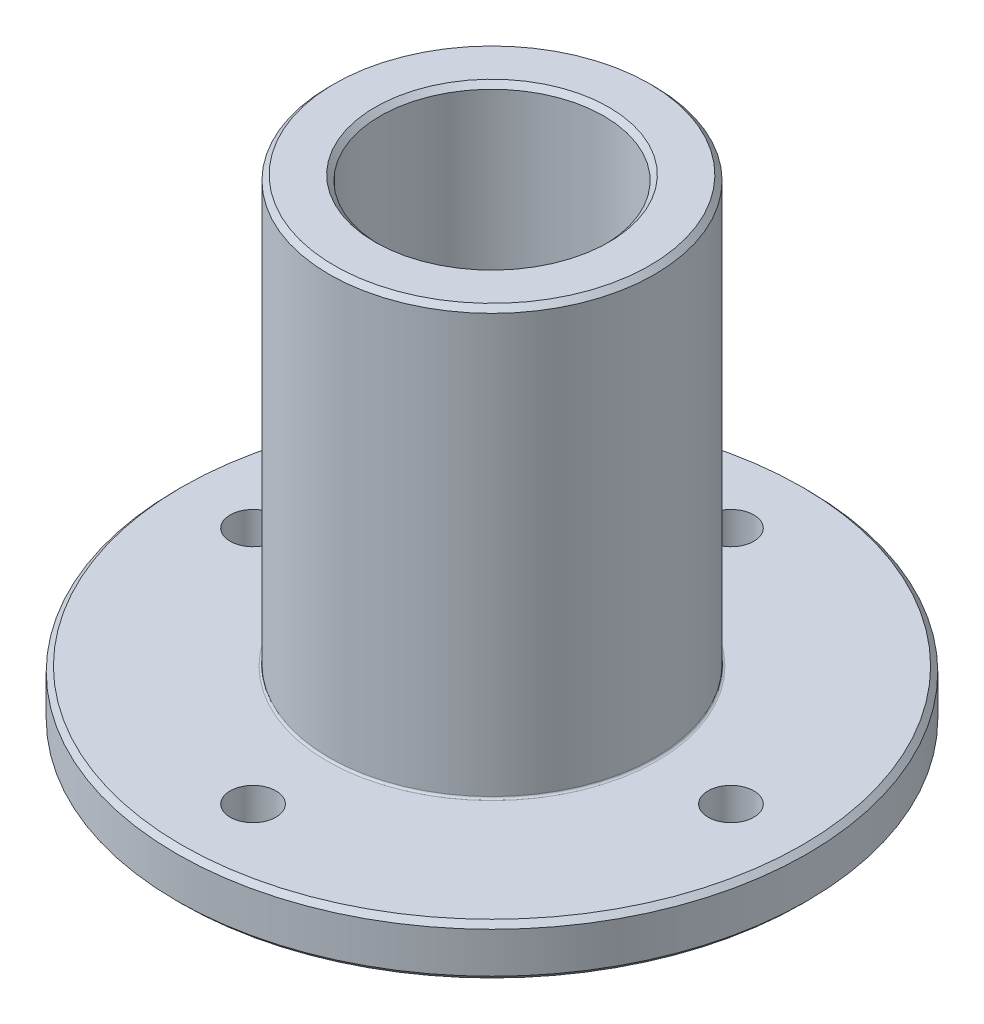
ISO-10303-21;
HEADER;
FILE_DESCRIPTION(('STEP AP214'),'2;1');
FILE_NAME('part.step','',(''),(''),'','','');
FILE_SCHEMA(('AUTOMOTIVE_DESIGN { 1 0 10303 214 1 1 1 1 }'));
ENDSEC;
DATA;
#1=APPLICATION_CONTEXT('core data for automotive mechanical design processes');
#2=APPLICATION_PROTOCOL_DEFINITION('international standard','automotive_design',2000,#1);
#3=PRODUCT_CONTEXT('',#1,'mechanical');
#4=PRODUCT('Part','Part','',(#3));
#5=PRODUCT_RELATED_PRODUCT_CATEGORY('part','',(#4));
#6=PRODUCT_DEFINITION_FORMATION('','',#4);
#7=PRODUCT_DEFINITION_CONTEXT('part definition',#1,'design');
#8=PRODUCT_DEFINITION('design','',#6,#7);
#9=PRODUCT_DEFINITION_SHAPE('','',#8);
#10=(LENGTH_UNIT() NAMED_UNIT(*) SI_UNIT(.MILLI.,.METRE.));
#11=(NAMED_UNIT(*) PLANE_ANGLE_UNIT() SI_UNIT($,.RADIAN.));
#12=(NAMED_UNIT(*) SI_UNIT($,.STERADIAN.) SOLID_ANGLE_UNIT());
#13=UNCERTAINTY_MEASURE_WITH_UNIT(LENGTH_MEASURE(1.E-05),#10,'distance_accuracy_value','');
#14=(GEOMETRIC_REPRESENTATION_CONTEXT(3) GLOBAL_UNCERTAINTY_ASSIGNED_CONTEXT((#13)) GLOBAL_UNIT_ASSIGNED_CONTEXT((#10,
#11,#12)) REPRESENTATION_CONTEXT('',''));
#15=CARTESIAN_POINT('',(0.,0.,0.));
#16=DIRECTION('',(0.,0.,1.));
#17=DIRECTION('',(1.,0.,0.));
#18=AXIS2_PLACEMENT_3D('',#15,#16,#17);
#19=CARTESIAN_POINT('',(0.,9.48818897637795,0.));
#20=DIRECTION('',(0.,1.,0.));
#21=DIRECTION('',(0.,0.,1.));
#22=AXIS2_PLACEMENT_3D('',#19,#20,#21);
#23=CYLINDRICAL_SURFACE('',#22,11.);
#24=CARTESIAN_POINT('',(0.,9.04999999999998,0.));
#25=DIRECTION('',(0.,-1.,0.));
#26=DIRECTION('',(0.,0.,-1.));
#27=AXIS2_PLACEMENT_3D('',#24,#25,#26);
#28=CIRCLE('',#27,11.);
#29=CARTESIAN_POINT('',(0.,9.04999999999998,-11.));
#30=VERTEX_POINT('',#29);
#31=EDGE_CURVE('E75',#30,#30,#28,.T.);
#32=ORIENTED_EDGE('',*,*,#31,.T.);
#33=EDGE_LOOP('',(#32));
#34=FACE_BOUND('',#33,.T.);
#35=CARTESIAN_POINT('',(0.,14.85,0.));
#36=DIRECTION('',(0.,1.,0.));
#37=DIRECTION('',(0.,0.,1.));
#38=AXIS2_PLACEMENT_3D('',#35,#36,#37);
#39=CIRCLE('',#38,11.);
#40=CARTESIAN_POINT('',(0.,14.85,11.));
#41=VERTEX_POINT('',#40);
#42=EDGE_CURVE('E88',#41,#41,#39,.F.);
#43=ORIENTED_EDGE('',*,*,#42,.F.);
#44=EDGE_LOOP('',(#43));
#45=FACE_BOUND('',#44,.T.);
#46=ADVANCED_FACE('F31',(#34,#45),#23,.F.);
#47=CARTESIAN_POINT('',(0.,46.3499999999999,0.));
#48=DIRECTION('',(0.,-1.,0.));
#49=DIRECTION('',(0.,0.,-1.));
#50=AXIS2_PLACEMENT_3D('',#47,#48,#49);
#51=CIRCLE('',#50,11.);
#52=CARTESIAN_POINT('',(0.,46.3499999999999,-11.));
#53=VERTEX_POINT('',#52);
#54=EDGE_CURVE('E38',#53,#53,#51,.F.);
#55=ORIENTED_EDGE('',*,*,#54,.T.);
#56=EDGE_LOOP('',(#55));
#57=FACE_BOUND('',#56,.T.);
#58=CARTESIAN_POINT('',(0.,15.95,0.));
#59=DIRECTION('',(0.,-1.,0.));
#60=DIRECTION('',(0.,0.,-1.));
#61=AXIS2_PLACEMENT_3D('',#58,#59,#60);
#62=CIRCLE('',#61,11.);
#63=CARTESIAN_POINT('',(0.,15.95,-11.));
#64=VERTEX_POINT('',#63);
#65=EDGE_CURVE('E92',#64,#64,#62,.F.);
#66=ORIENTED_EDGE('',*,*,#65,.F.);
#67=EDGE_LOOP('',(#66));
#68=FACE_BOUND('',#67,.T.);
#69=ADVANCED_FACE('F141',(#57,#68),#23,.F.);
#70=CARTESIAN_POINT('',(0.,9.48818897637795,0.));
#71=DIRECTION('',(0.,1.,0.));
#72=DIRECTION('',(0.,0.,1.));
#73=AXIS2_PLACEMENT_3D('',#70,#71,#72);
#74=CYLINDRICAL_SURFACE('',#73,9.);
#75=CARTESIAN_POINT('',(0.,0.499999999999992,0.));
#76=DIRECTION('',(0.,1.,0.));
#77=DIRECTION('',(0.,0.,1.));
#78=AXIS2_PLACEMENT_3D('',#75,#76,#77);
#79=CIRCLE('',#78,9.);
#80=CARTESIAN_POINT('',(0.,0.499999999999992,9.));
#81=VERTEX_POINT('',#80);
#82=EDGE_CURVE('E42',#81,#81,#79,.F.);
#83=ORIENTED_EDGE('',*,*,#82,.T.);
#84=EDGE_LOOP('',(#83));
#85=FACE_BOUND('',#84,.T.);
#86=CARTESIAN_POINT('',(0.,8.34999999999999,0.));
#87=DIRECTION('',(0.,-1.,0.));
#88=DIRECTION('',(0.,0.,-1.));
#89=AXIS2_PLACEMENT_3D('',#86,#87,#88);
#90=CIRCLE('',#89,9.);
#91=CARTESIAN_POINT('',(0.,8.34999999999999,-9.));
#92=VERTEX_POINT('',#91);
#93=EDGE_CURVE('E46',#92,#92,#90,.F.);
#94=ORIENTED_EDGE('',*,*,#93,.T.);
#95=EDGE_LOOP('',(#94));
#96=FACE_BOUND('',#95,.T.);
#97=ADVANCED_FACE('F143',(#85,#96),#74,.F.);
#98=CARTESIAN_POINT('',(9.,0.,0.));
#99=DIRECTION('',(0.,1.,0.));
#100=DIRECTION('',(0.,0.,1.));
#101=AXIS2_PLACEMENT_3D('',#98,#99,#100);
#102=PLANE('',#101);
#103=CARTESIAN_POINT('',(0.,0.,0.));
#104=DIRECTION('',(0.,1.,0.));
#105=DIRECTION('',(0.,0.,1.));
#106=AXIS2_PLACEMENT_3D('',#103,#104,#105);
#107=CIRCLE('',#106,30.5);
#108=CARTESIAN_POINT('',(0.,0.,30.5));
#109=VERTEX_POINT('',#108);
#110=EDGE_CURVE('E63',#109,#109,#107,.F.);
#111=ORIENTED_EDGE('',*,*,#110,.T.);
#112=EDGE_LOOP('',(#111));
#113=FACE_BOUND('',#112,.T.);
#114=CARTESIAN_POINT('',(0.,0.,0.));
#115=DIRECTION('',(0.,1.,0.));
#116=DIRECTION('',(0.,0.,1.));
#117=AXIS2_PLACEMENT_3D('',#114,#115,#116);
#118=CIRCLE('',#117,9.49999999999999);
#119=CARTESIAN_POINT('',(0.,0.,9.49999999999999));
#120=VERTEX_POINT('',#119);
#121=EDGE_CURVE('E66',#120,#120,#118,.T.);
#122=ORIENTED_EDGE('',*,*,#121,.T.);
#123=EDGE_LOOP('',(#122));
#124=FACE_BOUND('',#123,.T.);
#125=CARTESIAN_POINT('',(23.5,0.,0.));
#126=DIRECTION('',(0.,1.,0.));
#127=DIRECTION('',(0.,0.,1.));
#128=AXIS2_PLACEMENT_3D('',#125,#126,#127);
#129=CIRCLE('',#128,2.25);
#130=CARTESIAN_POINT('',(23.5,0.,2.25));
#131=VERTEX_POINT('',#130);
#132=EDGE_CURVE('E113',#131,#131,#129,.T.);
#133=ORIENTED_EDGE('',*,*,#132,.T.);
#134=EDGE_LOOP('',(#133));
#135=FACE_BOUND('',#134,.T.);
#136=CARTESIAN_POINT('',(0.,0.,-23.5));
#137=DIRECTION('',(0.,1.,0.));
#138=DIRECTION('',(0.,0.,1.));
#139=AXIS2_PLACEMENT_3D('',#136,#137,#138);
#140=CIRCLE('',#139,2.25);
#141=CARTESIAN_POINT('',(0.,0.,-21.25));
#142=VERTEX_POINT('',#141);
#143=EDGE_CURVE('E107',#142,#142,#140,.T.);
#144=ORIENTED_EDGE('',*,*,#143,.T.);
#145=EDGE_LOOP('',(#144));
#146=FACE_BOUND('',#145,.T.);
#147=CARTESIAN_POINT('',(0.,0.,23.5));
#148=DIRECTION('',(0.,1.,0.));
#149=DIRECTION('',(0.,0.,1.));
#150=AXIS2_PLACEMENT_3D('',#147,#148,#149);
#151=CIRCLE('',#150,2.25);
#152=CARTESIAN_POINT('',(0.,0.,25.75));
#153=VERTEX_POINT('',#152);
#154=EDGE_CURVE('E101',#153,#153,#151,.T.);
#155=ORIENTED_EDGE('',*,*,#154,.T.);
#156=EDGE_LOOP('',(#155));
#157=FACE_BOUND('',#156,.T.);
#158=CARTESIAN_POINT('',(-23.5,0.,0.));
#159=DIRECTION('',(0.,1.,0.));
#160=DIRECTION('',(0.,0.,1.));
#161=AXIS2_PLACEMENT_3D('',#158,#159,#160);
#162=CIRCLE('',#161,2.25);
#163=CARTESIAN_POINT('',(-23.5,0.,2.25));
#164=VERTEX_POINT('',#163);
#165=EDGE_CURVE('E87',#164,#164,#162,.T.);
#166=ORIENTED_EDGE('',*,*,#165,.T.);
#167=EDGE_LOOP('',(#166));
#168=FACE_BOUND('',#167,.T.);
#169=ADVANCED_FACE('F149',(#113,#124,#135,#146,#157,#168),#102,.F.);
#170=CARTESIAN_POINT('',(0.,9.48818897637795,0.));
#171=DIRECTION('',(0.,1.,0.));
#172=DIRECTION('',(0.,0.,1.));
#173=AXIS2_PLACEMENT_3D('',#170,#171,#172);
#174=CYLINDRICAL_SURFACE('',#173,31.);
#175=CARTESIAN_POINT('',(0.,0.5,0.));
#176=DIRECTION('',(0.,1.,0.));
#177=DIRECTION('',(0.,0.,1.));
#178=AXIS2_PLACEMENT_3D('',#175,#176,#177);
#179=CIRCLE('',#178,31.);
#180=CARTESIAN_POINT('',(0.,0.5,31.));
#181=VERTEX_POINT('',#180);
#182=EDGE_CURVE('E69',#181,#181,#179,.T.);
#183=ORIENTED_EDGE('',*,*,#182,.T.);
#184=EDGE_LOOP('',(#183));
#185=FACE_BOUND('',#184,.T.);
#186=CARTESIAN_POINT('',(0.,4.49999999999998,0.));
#187=DIRECTION('',(0.,-1.,0.));
#188=DIRECTION('',(0.,0.,-1.));
#189=AXIS2_PLACEMENT_3D('',#186,#187,#188);
#190=CIRCLE('',#189,31.);
#191=CARTESIAN_POINT('',(0.,4.49999999999998,-31.));
#192=VERTEX_POINT('',#191);
#193=EDGE_CURVE('E72',#192,#192,#190,.T.);
#194=ORIENTED_EDGE('',*,*,#193,.T.);
#195=EDGE_LOOP('',(#194));
#196=FACE_BOUND('',#195,.T.);
#197=ADVANCED_FACE('F168',(#185,#196),#174,.T.);
#198=CARTESIAN_POINT('',(31.,5.,0.));
#199=DIRECTION('',(0.,-1.,0.));
#200=DIRECTION('',(0.,0.,-1.));
#201=AXIS2_PLACEMENT_3D('',#198,#199,#200);
#202=PLANE('',#201);
#203=CARTESIAN_POINT('',(0.,5.,0.));
#204=DIRECTION('',(0.,-1.,0.));
#205=DIRECTION('',(0.,0.,-1.));
#206=AXIS2_PLACEMENT_3D('',#203,#204,#205);
#207=CIRCLE('',#206,30.5);
#208=CARTESIAN_POINT('',(0.,5.,-30.5));
#209=VERTEX_POINT('',#208);
#210=EDGE_CURVE('E60',#209,#209,#207,.F.);
#211=ORIENTED_EDGE('',*,*,#210,.T.);
#212=EDGE_LOOP('',(#211));
#213=FACE_BOUND('',#212,.T.);
#214=CARTESIAN_POINT('',(0.,5.,0.));
#215=DIRECTION('',(0.,-1.,0.));
#216=DIRECTION('',(0.,0.,-1.));
#217=AXIS2_PLACEMENT_3D('',#214,#215,#216);
#218=CIRCLE('',#217,16.2);
#219=CARTESIAN_POINT('',(0.,5.,-16.2));
#220=VERTEX_POINT('',#219);
#221=EDGE_CURVE('E81',#220,#220,#218,.T.);
#222=ORIENTED_EDGE('',*,*,#221,.T.);
#223=EDGE_LOOP('',(#222));
#224=FACE_BOUND('',#223,.T.);
#225=CARTESIAN_POINT('',(23.5,5.,0.));
#226=DIRECTION('',(0.,1.,0.));
#227=DIRECTION('',(0.,0.,1.));
#228=AXIS2_PLACEMENT_3D('',#225,#226,#227);
#229=CIRCLE('',#228,2.25);
#230=CARTESIAN_POINT('',(23.5,5.,2.25));
#231=VERTEX_POINT('',#230);
#232=EDGE_CURVE('E91',#231,#231,#229,.T.);
#233=ORIENTED_EDGE('',*,*,#232,.F.);
#234=EDGE_LOOP('',(#233));
#235=FACE_BOUND('',#234,.T.);
#236=CARTESIAN_POINT('',(0.,5.,-23.5));
#237=DIRECTION('',(0.,1.,0.));
#238=DIRECTION('',(0.,0.,1.));
#239=AXIS2_PLACEMENT_3D('',#236,#237,#238);
#240=CIRCLE('',#239,2.25);
#241=CARTESIAN_POINT('',(0.,5.,-21.25));
#242=VERTEX_POINT('',#241);
#243=EDGE_CURVE('E110',#242,#242,#240,.T.);
#244=ORIENTED_EDGE('',*,*,#243,.F.);
#245=EDGE_LOOP('',(#244));
#246=FACE_BOUND('',#245,.T.);
#247=CARTESIAN_POINT('',(0.,5.,23.5));
#248=DIRECTION('',(0.,1.,0.));
#249=DIRECTION('',(0.,0.,1.));
#250=AXIS2_PLACEMENT_3D('',#247,#248,#249);
#251=CIRCLE('',#250,2.25);
#252=CARTESIAN_POINT('',(0.,5.,25.75));
#253=VERTEX_POINT('',#252);
#254=EDGE_CURVE('E104',#253,#253,#251,.T.);
#255=ORIENTED_EDGE('',*,*,#254,.F.);
#256=EDGE_LOOP('',(#255));
#257=FACE_BOUND('',#256,.T.);
#258=CARTESIAN_POINT('',(-23.5,5.,0.));
#259=DIRECTION('',(0.,1.,0.));
#260=DIRECTION('',(0.,0.,1.));
#261=AXIS2_PLACEMENT_3D('',#258,#259,#260);
#262=CIRCLE('',#261,2.25);
#263=CARTESIAN_POINT('',(-23.5,5.,2.25));
#264=VERTEX_POINT('',#263);
#265=EDGE_CURVE('E98',#264,#264,#262,.T.);
#266=ORIENTED_EDGE('',*,*,#265,.F.);
#267=EDGE_LOOP('',(#266));
#268=FACE_BOUND('',#267,.T.);
#269=ADVANCED_FACE('F164',(#213,#224,#235,#246,#257,#268),#202,.F.);
#270=CARTESIAN_POINT('',(0.,9.48818897637795,0.));
#271=DIRECTION('',(0.,1.,0.));
#272=DIRECTION('',(0.,0.,1.));
#273=AXIS2_PLACEMENT_3D('',#270,#271,#272);
#274=CYLINDRICAL_SURFACE('',#273,16.);
#275=CARTESIAN_POINT('',(0.,46.35,0.));
#276=DIRECTION('',(0.,-1.,0.));
#277=DIRECTION('',(0.,0.,-1.));
#278=AXIS2_PLACEMENT_3D('',#275,#276,#277);
#279=CIRCLE('',#278,16.);
#280=CARTESIAN_POINT('',(0.,46.35,-16.));
#281=VERTEX_POINT('',#280);
#282=EDGE_CURVE('E51',#281,#281,#279,.T.);
#283=ORIENTED_EDGE('',*,*,#282,.T.);
#284=EDGE_LOOP('',(#283));
#285=FACE_BOUND('',#284,.T.);
#286=CARTESIAN_POINT('',(0.,5.2,0.));
#287=DIRECTION('',(0.,-1.,0.));
#288=DIRECTION('',(0.,0.,-1.));
#289=AXIS2_PLACEMENT_3D('',#286,#287,#288);
#290=CIRCLE('',#289,16.);
#291=CARTESIAN_POINT('',(0.,5.2,-16.));
#292=VERTEX_POINT('',#291);
#293=EDGE_CURVE('E84',#292,#292,#290,.F.);
#294=ORIENTED_EDGE('',*,*,#293,.T.);
#295=EDGE_LOOP('',(#294));
#296=FACE_BOUND('',#295,.T.);
#297=ADVANCED_FACE('F160',(#285,#296),#274,.T.);
#298=CARTESIAN_POINT('',(16.,46.85,0.));
#299=DIRECTION('',(0.,-1.,0.));
#300=DIRECTION('',(0.,0.,-1.));
#301=AXIS2_PLACEMENT_3D('',#298,#299,#300);
#302=PLANE('',#301);
#303=CARTESIAN_POINT('',(0.,46.85,0.));
#304=DIRECTION('',(0.,-1.,0.));
#305=DIRECTION('',(0.,0.,-1.));
#306=AXIS2_PLACEMENT_3D('',#303,#304,#305);
#307=CIRCLE('',#306,15.5);
#308=CARTESIAN_POINT('',(0.,46.85,-15.5));
#309=VERTEX_POINT('',#308);
#310=EDGE_CURVE('E54',#309,#309,#307,.F.);
#311=ORIENTED_EDGE('',*,*,#310,.T.);
#312=EDGE_LOOP('',(#311));
#313=FACE_BOUND('',#312,.T.);
#314=CARTESIAN_POINT('',(0.,46.85,0.));
#315=DIRECTION('',(0.,-1.,0.));
#316=DIRECTION('',(0.,0.,-1.));
#317=AXIS2_PLACEMENT_3D('',#314,#315,#316);
#318=CIRCLE('',#317,11.5);
#319=CARTESIAN_POINT('',(0.,46.85,-11.5));
#320=VERTEX_POINT('',#319);
#321=EDGE_CURVE('E57',#320,#320,#318,.T.);
#322=ORIENTED_EDGE('',*,*,#321,.T.);
#323=EDGE_LOOP('',(#322));
#324=FACE_BOUND('',#323,.T.);
#325=ADVANCED_FACE('F157',(#313,#324),#302,.F.);
#326=CARTESIAN_POINT('',(11.,8.84999999999998,0.));
#327=DIRECTION('',(0.,-1.,0.));
#328=DIRECTION('',(0.,0.,-1.));
#329=AXIS2_PLACEMENT_3D('',#326,#327,#328);
#330=PLANE('',#329);
#331=CARTESIAN_POINT('',(0.,8.84999999999998,0.));
#332=DIRECTION('',(0.,-1.,0.));
#333=DIRECTION('',(0.,0.,-1.));
#334=AXIS2_PLACEMENT_3D('',#331,#332,#333);
#335=CIRCLE('',#334,9.49999999999999);
#336=CARTESIAN_POINT('',(0.,8.84999999999998,-9.49999999999999));
#337=VERTEX_POINT('',#336);
#338=EDGE_CURVE('E10',#337,#337,#335,.T.);
#339=ORIENTED_EDGE('',*,*,#338,.T.);
#340=EDGE_LOOP('',(#339));
#341=FACE_BOUND('',#340,.T.);
#342=CARTESIAN_POINT('',(0.,8.84999999999998,0.));
#343=DIRECTION('',(0.,-1.,0.));
#344=DIRECTION('',(0.,0.,-1.));
#345=AXIS2_PLACEMENT_3D('',#342,#343,#344);
#346=CIRCLE('',#345,10.8);
#347=CARTESIAN_POINT('',(0.,8.84999999999998,-10.8));
#348=VERTEX_POINT('',#347);
#349=EDGE_CURVE('E78',#348,#348,#346,.F.);
#350=ORIENTED_EDGE('',*,*,#349,.T.);
#351=EDGE_LOOP('',(#350));
#352=FACE_BOUND('',#351,.T.);
#353=ADVANCED_FACE('F155',(#341,#352),#330,.F.);
#354=CARTESIAN_POINT('',(-23.5,5.,0.));
#355=DIRECTION('',(0.,1.,0.));
#356=DIRECTION('',(0.,0.,1.));
#357=AXIS2_PLACEMENT_3D('',#354,#355,#356);
#358=CYLINDRICAL_SURFACE('',#357,2.25);
#359=ORIENTED_EDGE('',*,*,#265,.T.);
#360=EDGE_LOOP('',(#359));
#361=FACE_BOUND('',#360,.T.);
#362=ORIENTED_EDGE('',*,*,#165,.F.);
#363=EDGE_LOOP('',(#362));
#364=FACE_BOUND('',#363,.T.);
#365=ADVANCED_FACE('F252',(#361,#364),#358,.F.);
#366=CARTESIAN_POINT('',(0.,5.,23.5));
#367=DIRECTION('',(0.,1.,0.));
#368=DIRECTION('',(0.,0.,1.));
#369=AXIS2_PLACEMENT_3D('',#366,#367,#368);
#370=CYLINDRICAL_SURFACE('',#369,2.25);
#371=ORIENTED_EDGE('',*,*,#254,.T.);
#372=EDGE_LOOP('',(#371));
#373=FACE_BOUND('',#372,.T.);
#374=ORIENTED_EDGE('',*,*,#154,.F.);
#375=EDGE_LOOP('',(#374));
#376=FACE_BOUND('',#375,.T.);
#377=ADVANCED_FACE('F372',(#373,#376),#370,.F.);
#378=CARTESIAN_POINT('',(0.,5.,-23.5));
#379=DIRECTION('',(0.,1.,0.));
#380=DIRECTION('',(0.,0.,1.));
#381=AXIS2_PLACEMENT_3D('',#378,#379,#380);
#382=CYLINDRICAL_SURFACE('',#381,2.25);
#383=ORIENTED_EDGE('',*,*,#243,.T.);
#384=EDGE_LOOP('',(#383));
#385=FACE_BOUND('',#384,.T.);
#386=ORIENTED_EDGE('',*,*,#143,.F.);
#387=EDGE_LOOP('',(#386));
#388=FACE_BOUND('',#387,.T.);
#389=ADVANCED_FACE('F362',(#385,#388),#382,.F.);
#390=CARTESIAN_POINT('',(23.5,5.,0.));
#391=DIRECTION('',(0.,1.,0.));
#392=DIRECTION('',(0.,0.,1.));
#393=AXIS2_PLACEMENT_3D('',#390,#391,#392);
#394=CYLINDRICAL_SURFACE('',#393,2.25);
#395=ORIENTED_EDGE('',*,*,#232,.T.);
#396=EDGE_LOOP('',(#395));
#397=FACE_BOUND('',#396,.T.);
#398=ORIENTED_EDGE('',*,*,#132,.F.);
#399=EDGE_LOOP('',(#398));
#400=FACE_BOUND('',#399,.T.);
#401=ADVANCED_FACE('F353',(#397,#400),#394,.F.);
#402=CARTESIAN_POINT('',(0.,14.85,11.39));
#403=DIRECTION('',(0.,1.,0.));
#404=DIRECTION('',(0.,0.,1.));
#405=AXIS2_PLACEMENT_3D('',#402,#403,#404);
#406=PLANE('',#405);
#407=CARTESIAN_POINT('',(0.,14.85,0.));
#408=DIRECTION('',(0.,1.,0.));
#409=DIRECTION('',(0.,0.,1.));
#410=AXIS2_PLACEMENT_3D('',#407,#408,#409);
#411=CIRCLE('',#410,11.39);
#412=CARTESIAN_POINT('',(0.,14.85,11.39));
#413=VERTEX_POINT('',#412);
#414=EDGE_CURVE('E95',#413,#413,#411,.T.);
#415=ORIENTED_EDGE('',*,*,#414,.T.);
#416=EDGE_LOOP('',(#415));
#417=FACE_BOUND('',#416,.T.);
#418=ORIENTED_EDGE('',*,*,#42,.T.);
#419=EDGE_LOOP('',(#418));
#420=FACE_BOUND('',#419,.T.);
#421=ADVANCED_FACE('F137',(#417,#420),#406,.T.);
#422=CARTESIAN_POINT('',(0.,15.95,9.9));
#423=DIRECTION('',(0.,-1.,0.));
#424=DIRECTION('',(0.,0.,-1.));
#425=AXIS2_PLACEMENT_3D('',#422,#423,#424);
#426=PLANE('',#425);
#427=CARTESIAN_POINT('',(0.,15.95,0.));
#428=DIRECTION('',(0.,1.,0.));
#429=DIRECTION('',(0.,0.,1.));
#430=AXIS2_PLACEMENT_3D('',#427,#428,#429);
#431=CIRCLE('',#430,11.39);
#432=CARTESIAN_POINT('',(0.,15.95,11.39));
#433=VERTEX_POINT('',#432);
#434=EDGE_CURVE('E126',#433,#433,#431,.T.);
#435=ORIENTED_EDGE('',*,*,#434,.F.);
#436=EDGE_LOOP('',(#435));
#437=FACE_BOUND('',#436,.T.);
#438=ORIENTED_EDGE('',*,*,#65,.T.);
#439=EDGE_LOOP('',(#438));
#440=FACE_BOUND('',#439,.T.);
#441=ADVANCED_FACE('F133',(#437,#440),#426,.T.);
#442=CARTESIAN_POINT('',(0.,14.96,0.));
#443=DIRECTION('',(0.,1.,0.));
#444=DIRECTION('',(0.,0.,1.));
#445=AXIS2_PLACEMENT_3D('',#442,#443,#444);
#446=TOROIDAL_SURFACE('',#445,11.39,0.110000000000002);
#447=CARTESIAN_POINT('',(0.,14.96,0.));
#448=DIRECTION('',(0.,1.,0.));
#449=DIRECTION('',(0.,0.,1.));
#450=AXIS2_PLACEMENT_3D('',#447,#448,#449);
#451=CIRCLE('',#450,11.5);
#452=CARTESIAN_POINT('',(0.,14.96,11.5));
#453=VERTEX_POINT('',#452);
#454=EDGE_CURVE('E120',#453,#453,#451,.T.);
#455=ORIENTED_EDGE('',*,*,#454,.T.);
#456=EDGE_LOOP('',(#455));
#457=FACE_BOUND('',#456,.T.);
#458=ORIENTED_EDGE('',*,*,#414,.F.);
#459=EDGE_LOOP('',(#458));
#460=FACE_BOUND('',#459,.T.);
#461=ADVANCED_FACE('F136',(#457,#460),#446,.F.);
#462=CARTESIAN_POINT('',(0.,-40.5118110236221,0.));
#463=DIRECTION('',(0.,1.,0.));
#464=DIRECTION('',(0.,0.,1.));
#465=AXIS2_PLACEMENT_3D('',#462,#463,#464);
#466=CYLINDRICAL_SURFACE('',#465,11.5);
#467=CARTESIAN_POINT('',(0.,15.84,0.));
#468=DIRECTION('',(0.,1.,0.));
#469=DIRECTION('',(0.,0.,1.));
#470=AXIS2_PLACEMENT_3D('',#467,#468,#469);
#471=CIRCLE('',#470,11.5);
#472=CARTESIAN_POINT('',(0.,15.84,11.5));
#473=VERTEX_POINT('',#472);
#474=EDGE_CURVE('E123',#473,#473,#471,.T.);
#475=ORIENTED_EDGE('',*,*,#474,.T.);
#476=EDGE_LOOP('',(#475));
#477=FACE_BOUND('',#476,.T.);
#478=ORIENTED_EDGE('',*,*,#454,.F.);
#479=EDGE_LOOP('',(#478));
#480=FACE_BOUND('',#479,.T.);
#481=ADVANCED_FACE('F321',(#477,#480),#466,.F.);
#482=CARTESIAN_POINT('',(0.,15.84,0.));
#483=DIRECTION('',(0.,1.,0.));
#484=DIRECTION('',(0.,0.,1.));
#485=AXIS2_PLACEMENT_3D('',#482,#483,#484);
#486=TOROIDAL_SURFACE('',#485,11.39,0.110000000000002);
#487=ORIENTED_EDGE('',*,*,#434,.T.);
#488=EDGE_LOOP('',(#487));
#489=FACE_BOUND('',#488,.T.);
#490=ORIENTED_EDGE('',*,*,#474,.F.);
#491=EDGE_LOOP('',(#490));
#492=FACE_BOUND('',#491,.T.);
#493=ADVANCED_FACE('F130',(#489,#492),#486,.F.);
#494=CARTESIAN_POINT('',(0.,5.2,0.));
#495=DIRECTION('',(0.,-1.,0.));
#496=DIRECTION('',(0.,0.,-1.));
#497=AXIS2_PLACEMENT_3D('',#494,#495,#496);
#498=TOROIDAL_SURFACE('',#497,16.2,0.2);
#499=ORIENTED_EDGE('',*,*,#221,.F.);
#500=EDGE_LOOP('',(#499));
#501=FACE_BOUND('',#500,.T.);
#502=ORIENTED_EDGE('',*,*,#293,.F.);
#503=EDGE_LOOP('',(#502));
#504=FACE_BOUND('',#503,.T.);
#505=ADVANCED_FACE('F176',(#501,#504),#498,.F.);
#506=CARTESIAN_POINT('',(0.,9.04999999999998,0.));
#507=DIRECTION('',(0.,-1.,0.));
#508=DIRECTION('',(0.,0.,-1.));
#509=AXIS2_PLACEMENT_3D('',#506,#507,#508);
#510=TOROIDAL_SURFACE('',#509,10.8,0.2);
#511=ORIENTED_EDGE('',*,*,#31,.F.);
#512=EDGE_LOOP('',(#511));
#513=FACE_BOUND('',#512,.T.);
#514=ORIENTED_EDGE('',*,*,#349,.F.);
#515=EDGE_LOOP('',(#514));
#516=FACE_BOUND('',#515,.T.);
#517=ADVANCED_FACE('F179',(#513,#516),#510,.F.);
#518=CARTESIAN_POINT('',(0.,0.5,0.));
#519=DIRECTION('',(0.,1.,0.));
#520=DIRECTION('',(0.,0.,1.));
#521=AXIS2_PLACEMENT_3D('',#518,#519,#520);
#522=CONICAL_SURFACE('',#521,31.,0.785398163397459);
#523=ORIENTED_EDGE('',*,*,#110,.F.);
#524=EDGE_LOOP('',(#523));
#525=FACE_BOUND('',#524,.T.);
#526=ORIENTED_EDGE('',*,*,#182,.F.);
#527=EDGE_LOOP('',(#526));
#528=FACE_BOUND('',#527,.T.);
#529=ADVANCED_FACE('F183',(#525,#528),#522,.T.);
#530=CARTESIAN_POINT('',(0.,5.,0.));
#531=DIRECTION('',(0.,-1.,0.));
#532=DIRECTION('',(0.,0.,-1.));
#533=AXIS2_PLACEMENT_3D('',#530,#531,#532);
#534=CONICAL_SURFACE('',#533,30.5,0.785398163397448);
#535=ORIENTED_EDGE('',*,*,#193,.F.);
#536=EDGE_LOOP('',(#535));
#537=FACE_BOUND('',#536,.T.);
#538=ORIENTED_EDGE('',*,*,#210,.F.);
#539=EDGE_LOOP('',(#538));
#540=FACE_BOUND('',#539,.T.);
#541=ADVANCED_FACE('F187',(#537,#540),#534,.T.);
#542=CARTESIAN_POINT('',(0.,46.85,0.));
#543=DIRECTION('',(0.,-1.,0.));
#544=DIRECTION('',(0.,0.,-1.));
#545=AXIS2_PLACEMENT_3D('',#542,#543,#544);
#546=CONICAL_SURFACE('',#545,15.5,0.785398163397448);
#547=ORIENTED_EDGE('',*,*,#282,.F.);
#548=EDGE_LOOP('',(#547));
#549=FACE_BOUND('',#548,.T.);
#550=ORIENTED_EDGE('',*,*,#310,.F.);
#551=EDGE_LOOP('',(#550));
#552=FACE_BOUND('',#551,.T.);
#553=ADVANCED_FACE('F191',(#549,#552),#546,.T.);
#554=CARTESIAN_POINT('',(0.,0.,0.));
#555=DIRECTION('',(0.,-1.,0.));
#556=DIRECTION('',(0.,0.,-1.));
#557=AXIS2_PLACEMENT_3D('',#554,#555,#556);
#558=CONICAL_SURFACE('',#557,9.49999999999999,0.785398163397452);
#559=ORIENTED_EDGE('',*,*,#82,.F.);
#560=EDGE_LOOP('',(#559));
#561=FACE_BOUND('',#560,.T.);
#562=ORIENTED_EDGE('',*,*,#121,.F.);
#563=EDGE_LOOP('',(#562));
#564=FACE_BOUND('',#563,.T.);
#565=ADVANCED_FACE('F195',(#561,#564),#558,.F.);
#566=CARTESIAN_POINT('',(0.,46.3499999999999,0.));
#567=DIRECTION('',(0.,1.,0.));
#568=DIRECTION('',(0.,0.,1.));
#569=AXIS2_PLACEMENT_3D('',#566,#567,#568);
#570=CONICAL_SURFACE('',#569,11.,0.785398163397441);
#571=ORIENTED_EDGE('',*,*,#321,.F.);
#572=EDGE_LOOP('',(#571));
#573=FACE_BOUND('',#572,.T.);
#574=ORIENTED_EDGE('',*,*,#54,.F.);
#575=EDGE_LOOP('',(#574));
#576=FACE_BOUND('',#575,.T.);
#577=ADVANCED_FACE('F198',(#573,#576),#570,.F.);
#578=CARTESIAN_POINT('',(0.,8.34999999999999,0.));
#579=DIRECTION('',(0.,1.,0.));
#580=DIRECTION('',(0.,0.,1.));
#581=AXIS2_PLACEMENT_3D('',#578,#579,#580);
#582=CONICAL_SURFACE('',#581,9.,0.785398163397459);
#583=ORIENTED_EDGE('',*,*,#338,.F.);
#584=EDGE_LOOP('',(#583));
#585=FACE_BOUND('',#584,.T.);
#586=ORIENTED_EDGE('',*,*,#93,.F.);
#587=EDGE_LOOP('',(#586));
#588=FACE_BOUND('',#587,.T.);
#589=ADVANCED_FACE('F33',(#585,#588),#582,.F.);
#590=CLOSED_SHELL('',(#46,#69,#97,#169,#197,#269,#297,#325,#353,#365,#377,#389,#401,#421,#441,
#461,#481,#493,#505,#517,#529,#541,#553,#565,#577,#589));
#591=MANIFOLD_SOLID_BREP('B2',#590);
#592=ADVANCED_BREP_SHAPE_REPRESENTATION('',(#18,#591),#14);
#593=SHAPE_DEFINITION_REPRESENTATION(#9,#592);
ENDSEC;
END-ISO-10303-21;
